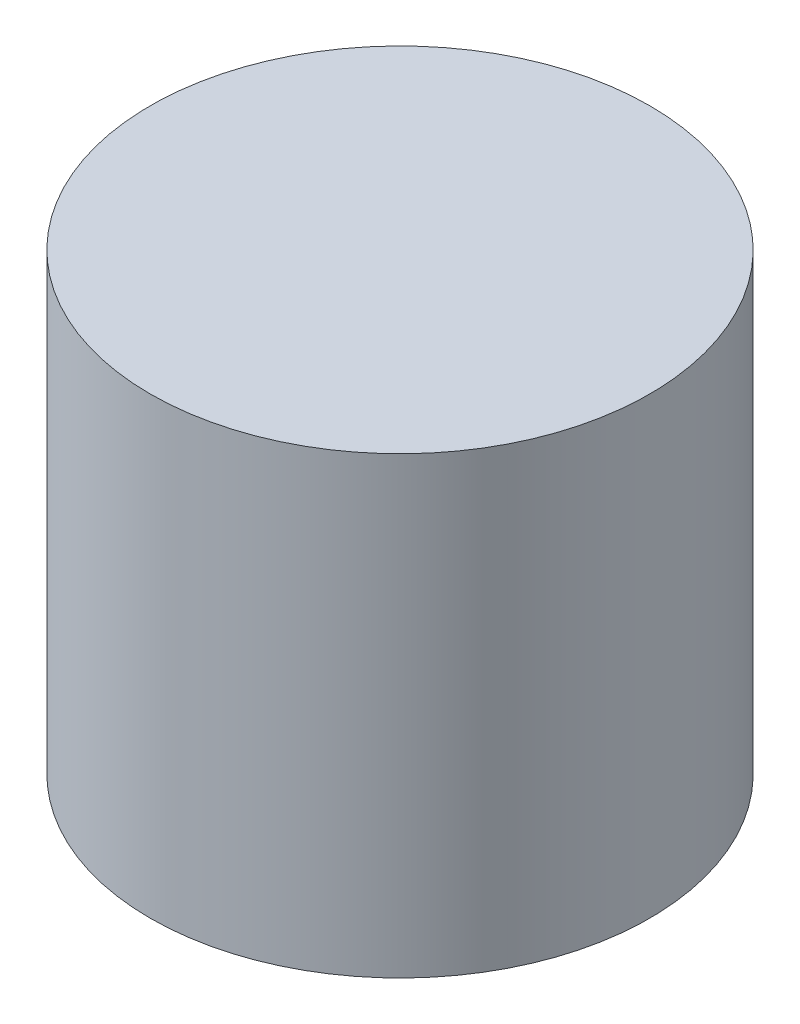
ISO-10303-21;
HEADER;
FILE_DESCRIPTION(('STEP AP214'),'2;1');
FILE_NAME('part.step','',(''),(''),'','','');
FILE_SCHEMA(('AUTOMOTIVE_DESIGN { 1 0 10303 214 1 1 1 1 }'));
ENDSEC;
DATA;
#1=APPLICATION_CONTEXT('core data for automotive mechanical design processes');
#2=APPLICATION_PROTOCOL_DEFINITION('international standard','automotive_design',2000,#1);
#3=PRODUCT_CONTEXT('',#1,'mechanical');
#4=PRODUCT('Part','Part','',(#3));
#5=PRODUCT_RELATED_PRODUCT_CATEGORY('part','',(#4));
#6=PRODUCT_DEFINITION_FORMATION('','',#4);
#7=PRODUCT_DEFINITION_CONTEXT('part definition',#1,'design');
#8=PRODUCT_DEFINITION('design','',#6,#7);
#9=PRODUCT_DEFINITION_SHAPE('','',#8);
#10=(LENGTH_UNIT() NAMED_UNIT(*) SI_UNIT(.MILLI.,.METRE.));
#11=(NAMED_UNIT(*) PLANE_ANGLE_UNIT() SI_UNIT($,.RADIAN.));
#12=(NAMED_UNIT(*) SI_UNIT($,.STERADIAN.) SOLID_ANGLE_UNIT());
#13=UNCERTAINTY_MEASURE_WITH_UNIT(LENGTH_MEASURE(1.E-05),#10,'distance_accuracy_value','');
#14=(GEOMETRIC_REPRESENTATION_CONTEXT(3) GLOBAL_UNCERTAINTY_ASSIGNED_CONTEXT((#13)) GLOBAL_UNIT_ASSIGNED_CONTEXT((#10,
#11,#12)) REPRESENTATION_CONTEXT('',''));
#15=CARTESIAN_POINT('',(0.,0.,0.));
#16=DIRECTION('',(0.,0.,1.));
#17=DIRECTION('',(1.,0.,0.));
#18=AXIS2_PLACEMENT_3D('',#15,#16,#17);
#19=CARTESIAN_POINT('',(0.,20.,0.));
#20=DIRECTION('',(0.,-1.,0.));
#21=DIRECTION('',(0.,0.,-1.));
#22=AXIS2_PLACEMENT_3D('',#19,#20,#21);
#23=CYLINDRICAL_SURFACE('',#22,11.);
#24=CARTESIAN_POINT('',(0.,20.,0.));
#25=DIRECTION('',(0.,1.,0.));
#26=DIRECTION('',(0.,0.,1.));
#27=AXIS2_PLACEMENT_3D('',#24,#25,#26);
#28=CIRCLE('',#27,11.);
#29=CARTESIAN_POINT('',(0.,20.,11.));
#30=VERTEX_POINT('',#29);
#31=EDGE_CURVE('E10',#30,#30,#28,.T.);
#32=ORIENTED_EDGE('',*,*,#31,.F.);
#33=EDGE_LOOP('',(#32));
#34=FACE_BOUND('',#33,.T.);
#35=CARTESIAN_POINT('',(0.,0.,0.));
#36=DIRECTION('',(0.,1.,0.));
#37=DIRECTION('',(0.,0.,1.));
#38=AXIS2_PLACEMENT_3D('',#35,#36,#37);
#39=CIRCLE('',#38,11.);
#40=CARTESIAN_POINT('',(0.,0.,11.));
#41=VERTEX_POINT('',#40);
#42=EDGE_CURVE('E40',#41,#41,#39,.T.);
#43=ORIENTED_EDGE('',*,*,#42,.T.);
#44=EDGE_LOOP('',(#43));
#45=FACE_BOUND('',#44,.T.);
#46=ADVANCED_FACE('F37',(#34,#45),#23,.T.);
#47=CARTESIAN_POINT('',(0.,20.,0.));
#48=DIRECTION('',(0.,1.,0.));
#49=DIRECTION('',(0.,0.,1.));
#50=AXIS2_PLACEMENT_3D('',#47,#48,#49);
#51=PLANE('',#50);
#52=ORIENTED_EDGE('',*,*,#31,.T.);
#53=EDGE_LOOP('',(#52));
#54=FACE_BOUND('',#53,.T.);
#55=ADVANCED_FACE('F54',(#54),#51,.T.);
#56=CARTESIAN_POINT('',(0.,0.,0.));
#57=DIRECTION('',(0.,1.,0.));
#58=DIRECTION('',(0.,0.,1.));
#59=AXIS2_PLACEMENT_3D('',#56,#57,#58);
#60=PLANE('',#59);
#61=ORIENTED_EDGE('',*,*,#42,.F.);
#62=EDGE_LOOP('',(#61));
#63=FACE_BOUND('',#62,.T.);
#64=ADVANCED_FACE('F52',(#63),#60,.F.);
#65=CLOSED_SHELL('',(#46,#55,#64));
#66=MANIFOLD_SOLID_BREP('B2',#65);
#67=ADVANCED_BREP_SHAPE_REPRESENTATION('',(#18,#66),#14);
#68=SHAPE_DEFINITION_REPRESENTATION(#9,#67);
ENDSEC;
END-ISO-10303-21;
